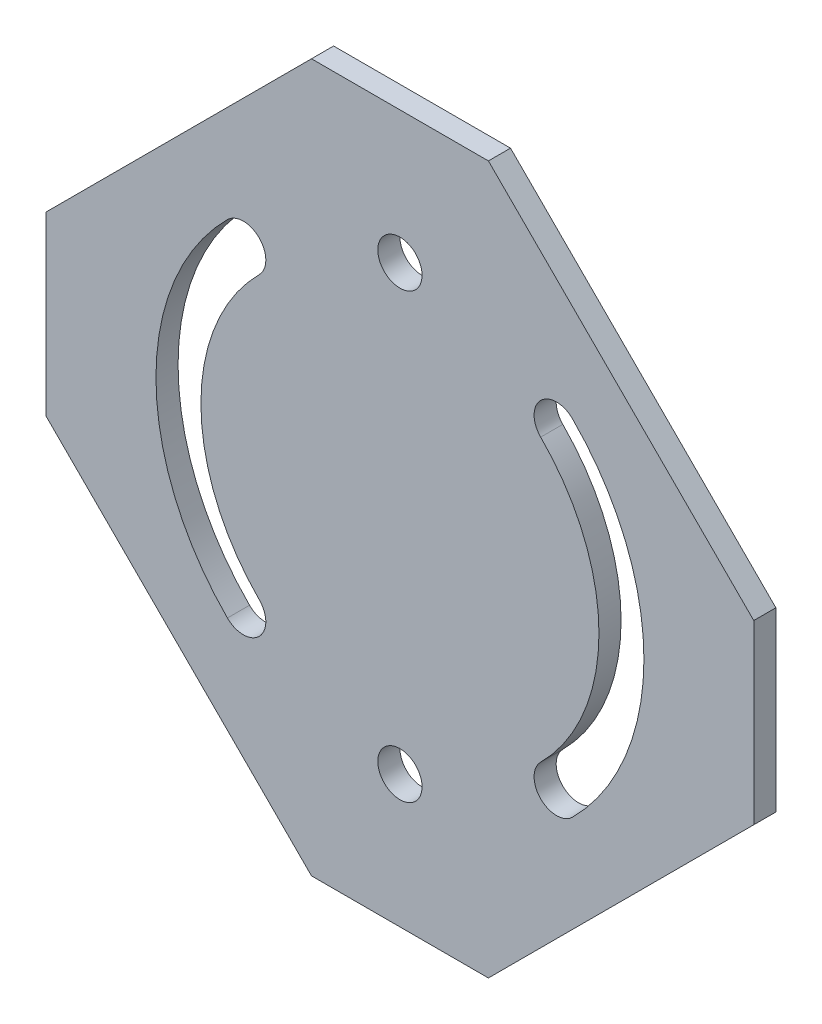
ISO-10303-21;
HEADER;
FILE_DESCRIPTION(('STEP AP214'),'2;1');
FILE_NAME('part.step','',(''),(''),'','','');
FILE_SCHEMA(('AUTOMOTIVE_DESIGN { 1 0 10303 214 1 1 1 1 }'));
ENDSEC;
DATA;
#1=APPLICATION_CONTEXT('core data for automotive mechanical design processes');
#2=APPLICATION_PROTOCOL_DEFINITION('international standard','automotive_design',2000,#1);
#3=PRODUCT_CONTEXT('',#1,'mechanical');
#4=PRODUCT('Part','Part','',(#3));
#5=PRODUCT_RELATED_PRODUCT_CATEGORY('part','',(#4));
#6=PRODUCT_DEFINITION_FORMATION('','',#4);
#7=PRODUCT_DEFINITION_CONTEXT('part definition',#1,'design');
#8=PRODUCT_DEFINITION('design','',#6,#7);
#9=PRODUCT_DEFINITION_SHAPE('','',#8);
#10=(LENGTH_UNIT() NAMED_UNIT(*) SI_UNIT(.MILLI.,.METRE.));
#11=(NAMED_UNIT(*) PLANE_ANGLE_UNIT() SI_UNIT($,.RADIAN.));
#12=(NAMED_UNIT(*) SI_UNIT($,.STERADIAN.) SOLID_ANGLE_UNIT());
#13=UNCERTAINTY_MEASURE_WITH_UNIT(LENGTH_MEASURE(1.E-05),#10,'distance_accuracy_value','');
#14=(GEOMETRIC_REPRESENTATION_CONTEXT(3) GLOBAL_UNCERTAINTY_ASSIGNED_CONTEXT((#13)) GLOBAL_UNIT_ASSIGNED_CONTEXT((#10,
#11,#12)) REPRESENTATION_CONTEXT('',''));
#15=CARTESIAN_POINT('',(0.,0.,0.));
#16=DIRECTION('',(0.,0.,1.));
#17=DIRECTION('',(1.,0.,0.));
#18=AXIS2_PLACEMENT_3D('',#15,#16,#17);
#19=CARTESIAN_POINT('',(0.,0.,3.));
#20=DIRECTION('',(0.,0.,1.));
#21=DIRECTION('',(1.,0.,0.));
#22=AXIS2_PLACEMENT_3D('',#19,#20,#21);
#23=PLANE('',#22);
#24=CARTESIAN_POINT('',(0.,0.,3.));
#25=DIRECTION('',(0.,0.,1.));
#26=DIRECTION('',(1.,0.,0.));
#27=AXIS2_PLACEMENT_3D('',#24,#25,#26);
#28=CIRCLE('',#27,33.1000000000003);
#29=CARTESIAN_POINT('',(-23.4052344572771,23.4052344572728,3.));
#30=VERTEX_POINT('',#29);
#31=CARTESIAN_POINT('',(-23.4052344572791,-23.4052344572712,3.));
#32=VERTEX_POINT('',#31);
#33=EDGE_CURVE('E156',#30,#32,#28,.T.);
#34=ORIENTED_EDGE('',*,*,#33,.F.);
#35=CARTESIAN_POINT('',(-21.248558774656,21.2485587746562,3.));
#36=DIRECTION('',(0.,0.,1.));
#37=DIRECTION('',(1.,0.,0.));
#38=AXIS2_PLACEMENT_3D('',#35,#36,#37);
#39=CIRCLE('',#38,3.05);
#40=CARTESIAN_POINT('',(-19.0918830920388,19.0918830920352,3.));
#41=VERTEX_POINT('',#40);
#42=EDGE_CURVE('E148',#41,#30,#39,.T.);
#43=ORIENTED_EDGE('',*,*,#42,.F.);
#44=CARTESIAN_POINT('',(0.,0.,3.));
#45=DIRECTION('',(0.,0.,-1.));
#46=DIRECTION('',(1.,0.,0.));
#47=AXIS2_PLACEMENT_3D('',#44,#45,#46);
#48=CIRCLE('',#47,27.0000000000003);
#49=CARTESIAN_POINT('',(-19.0918830920403,-19.0918830920338,3.));
#50=VERTEX_POINT('',#49);
#51=EDGE_CURVE('E171',#50,#41,#48,.T.);
#52=ORIENTED_EDGE('',*,*,#51,.F.);
#53=CARTESIAN_POINT('',(-21.2485587746564,-21.248558774656,3.));
#54=DIRECTION('',(0.,0.,1.));
#55=DIRECTION('',(1.,0.,0.));
#56=AXIS2_PLACEMENT_3D('',#53,#54,#55);
#57=CIRCLE('',#56,3.05);
#58=EDGE_CURVE('E169',#32,#50,#57,.T.);
#59=ORIENTED_EDGE('',*,*,#58,.F.);
#60=EDGE_LOOP('',(#34,#43,#52,#59));
#61=FACE_BOUND('',#60,.T.);
#62=CARTESIAN_POINT('',(0.,0.,3.));
#63=DIRECTION('',(0.,0.,1.));
#64=DIRECTION('',(1.,0.,0.));
#65=AXIS2_PLACEMENT_3D('',#62,#63,#64);
#66=CIRCLE('',#65,33.1);
#67=CARTESIAN_POINT('',(23.4052344572766,-23.4052344572728,3.));
#68=VERTEX_POINT('',#67);
#69=CARTESIAN_POINT('',(23.4052344572768,23.405234457273,3.));
#70=VERTEX_POINT('',#69);
#71=EDGE_CURVE('E195',#68,#70,#66,.T.);
#72=ORIENTED_EDGE('',*,*,#71,.F.);
#73=CARTESIAN_POINT('',(21.2485587746555,-21.2485587746563,3.));
#74=DIRECTION('',(0.,0.,1.));
#75=DIRECTION('',(1.,0.,0.));
#76=AXIS2_PLACEMENT_3D('',#73,#74,#75);
#77=CIRCLE('',#76,3.05);
#78=CARTESIAN_POINT('',(19.0918830920383,-19.0918830920352,3.));
#79=VERTEX_POINT('',#78);
#80=EDGE_CURVE('E193',#79,#68,#77,.T.);
#81=ORIENTED_EDGE('',*,*,#80,.F.);
#82=CARTESIAN_POINT('',(0.,0.,3.));
#83=DIRECTION('',(0.,0.,-1.));
#84=DIRECTION('',(1.,0.,0.));
#85=AXIS2_PLACEMENT_3D('',#82,#83,#84);
#86=CIRCLE('',#85,27.);
#87=CARTESIAN_POINT('',(19.0918830920383,19.0918830920352,3.));
#88=VERTEX_POINT('',#87);
#89=EDGE_CURVE('E201',#88,#79,#86,.T.);
#90=ORIENTED_EDGE('',*,*,#89,.F.);
#91=CARTESIAN_POINT('',(21.248558774656,21.2485587746559,3.));
#92=DIRECTION('',(0.,0.,1.));
#93=DIRECTION('',(1.,0.,0.));
#94=AXIS2_PLACEMENT_3D('',#91,#92,#93);
#95=CIRCLE('',#94,3.05);
#96=EDGE_CURVE('E198',#70,#88,#95,.T.);
#97=ORIENTED_EDGE('',*,*,#96,.F.);
#98=EDGE_LOOP('',(#72,#81,#90,#97));
#99=FACE_BOUND('',#98,.T.);
#100=DIRECTION('',(0.707106781186544,-0.707106781186551,0.));
#101=VECTOR('',#100,1.);
#102=CARTESIAN_POINT('',(-12.0000000000005,-48.0000000000003,3.));
#103=LINE('',#102,#101);
#104=CARTESIAN_POINT('',(-48.,-12.0000000000005,3.));
#105=VERTEX_POINT('',#104);
#106=CARTESIAN_POINT('',(-12.0000000000005,-48.0000000000003,3.));
#107=VERTEX_POINT('',#106);
#108=EDGE_CURVE('E224',#105,#107,#103,.T.);
#109=ORIENTED_EDGE('',*,*,#108,.T.);
#110=DIRECTION('',(1.,0.,0.));
#111=VECTOR('',#110,1.);
#112=CARTESIAN_POINT('',(-12.0000000000005,-48.0000000000003,3.));
#113=LINE('',#112,#111);
#114=CARTESIAN_POINT('',(12.,-48.0000000000003,3.));
#115=VERTEX_POINT('',#114);
#116=EDGE_CURVE('E227',#107,#115,#113,.T.);
#117=ORIENTED_EDGE('',*,*,#116,.T.);
#118=DIRECTION('',(0.707106781186549,0.707106781186546,0.));
#119=VECTOR('',#118,1.);
#120=CARTESIAN_POINT('',(12.,-48.0000000000003,3.));
#121=LINE('',#120,#119);
#122=CARTESIAN_POINT('',(48.,-12.0000000000005,3.));
#123=VERTEX_POINT('',#122);
#124=EDGE_CURVE('E230',#115,#123,#121,.T.);
#125=ORIENTED_EDGE('',*,*,#124,.T.);
#126=DIRECTION('',(0.,1.,0.));
#127=VECTOR('',#126,1.);
#128=CARTESIAN_POINT('',(48.,-12.0000000000005,3.));
#129=LINE('',#128,#127);
#130=CARTESIAN_POINT('',(48.0000000000005,12.,3.));
#131=VERTEX_POINT('',#130);
#132=EDGE_CURVE('E232',#123,#131,#129,.T.);
#133=ORIENTED_EDGE('',*,*,#132,.T.);
#134=DIRECTION('',(-0.707106781186547,0.707106781186547,0.));
#135=VECTOR('',#134,1.);
#136=CARTESIAN_POINT('',(48.0000000000005,12.,3.));
#137=LINE('',#136,#135);
#138=CARTESIAN_POINT('',(12.0000000000005,48.,3.));
#139=VERTEX_POINT('',#138);
#140=EDGE_CURVE('E234',#131,#139,#137,.T.);
#141=ORIENTED_EDGE('',*,*,#140,.T.);
#142=DIRECTION('',(-1.,0.,0.));
#143=VECTOR('',#142,1.);
#144=CARTESIAN_POINT('',(12.0000000000005,48.,3.));
#145=LINE('',#144,#143);
#146=CARTESIAN_POINT('',(-12.0000000000005,48.0000000000002,3.));
#147=VERTEX_POINT('',#146);
#148=EDGE_CURVE('E236',#139,#147,#145,.T.);
#149=ORIENTED_EDGE('',*,*,#148,.T.);
#150=DIRECTION('',(-0.707106781186549,-0.707106781186546,0.));
#151=VECTOR('',#150,1.);
#152=CARTESIAN_POINT('',(-12.0000000000005,48.0000000000002,3.));
#153=LINE('',#152,#151);
#154=CARTESIAN_POINT('',(-48.0000000000005,12.0000000000003,3.));
#155=VERTEX_POINT('',#154);
#156=EDGE_CURVE('E238',#147,#155,#153,.T.);
#157=ORIENTED_EDGE('',*,*,#156,.T.);
#158=DIRECTION('',(0.,-1.,0.));
#159=VECTOR('',#158,1.);
#160=CARTESIAN_POINT('',(-48.0000000000005,12.0000000000003,3.));
#161=LINE('',#160,#159);
#162=EDGE_CURVE('E240',#155,#105,#161,.T.);
#163=ORIENTED_EDGE('',*,*,#162,.T.);
#164=EDGE_LOOP('',(#109,#117,#125,#133,#141,#149,#157,#163));
#165=FACE_BOUND('',#164,.T.);
#166=CARTESIAN_POINT('',(0.,30.0500000000002,3.));
#167=DIRECTION('',(0.,0.,1.));
#168=DIRECTION('',(1.,0.,0.));
#169=AXIS2_PLACEMENT_3D('',#166,#167,#168);
#170=CIRCLE('',#169,3.);
#171=CARTESIAN_POINT('',(3.,30.0500000000002,3.));
#172=VERTEX_POINT('',#171);
#173=EDGE_CURVE('E187',#172,#172,#170,.T.);
#174=ORIENTED_EDGE('',*,*,#173,.F.);
#175=EDGE_LOOP('',(#174));
#176=FACE_BOUND('',#175,.T.);
#177=CARTESIAN_POINT('',(-4.54747350886464E-13,-30.0500000000004,3.));
#178=DIRECTION('',(0.,0.,1.));
#179=DIRECTION('',(1.,0.,0.));
#180=AXIS2_PLACEMENT_3D('',#177,#178,#179);
#181=CIRCLE('',#180,3.);
#182=CARTESIAN_POINT('',(2.99999999999955,-30.0500000000004,3.));
#183=VERTEX_POINT('',#182);
#184=EDGE_CURVE('E177',#183,#183,#181,.T.);
#185=ORIENTED_EDGE('',*,*,#184,.F.);
#186=EDGE_LOOP('',(#185));
#187=FACE_BOUND('',#186,.T.);
#188=ADVANCED_FACE('F35',(#61,#99,#165,#176,#187),#23,.T.);
#189=CARTESIAN_POINT('',(0.,0.,0.));
#190=DIRECTION('',(0.,0.,1.));
#191=DIRECTION('',(1.,0.,0.));
#192=AXIS2_PLACEMENT_3D('',#189,#190,#191);
#193=PLANE('',#192);
#194=CARTESIAN_POINT('',(-21.248558774656,21.2485587746562,0.));
#195=DIRECTION('',(0.,0.,1.));
#196=DIRECTION('',(1.,0.,0.));
#197=AXIS2_PLACEMENT_3D('',#194,#195,#196);
#198=CIRCLE('',#197,3.05);
#199=CARTESIAN_POINT('',(-19.0918830920388,19.0918830920352,0.));
#200=VERTEX_POINT('',#199);
#201=CARTESIAN_POINT('',(-23.4052344572771,23.4052344572728,0.));
#202=VERTEX_POINT('',#201);
#203=EDGE_CURVE('E58',#200,#202,#198,.T.);
#204=ORIENTED_EDGE('',*,*,#203,.T.);
#205=CARTESIAN_POINT('',(0.,0.,0.));
#206=DIRECTION('',(0.,0.,1.));
#207=DIRECTION('',(1.,0.,0.));
#208=AXIS2_PLACEMENT_3D('',#205,#206,#207);
#209=CIRCLE('',#208,33.1000000000003);
#210=CARTESIAN_POINT('',(-23.4052344572791,-23.4052344572712,0.));
#211=VERTEX_POINT('',#210);
#212=EDGE_CURVE('E163',#202,#211,#209,.T.);
#213=ORIENTED_EDGE('',*,*,#212,.T.);
#214=CARTESIAN_POINT('',(-21.2485587746564,-21.248558774656,0.));
#215=DIRECTION('',(0.,0.,1.));
#216=DIRECTION('',(1.,0.,0.));
#217=AXIS2_PLACEMENT_3D('',#214,#215,#216);
#218=CIRCLE('',#217,3.05);
#219=CARTESIAN_POINT('',(-19.0918830920403,-19.0918830920338,0.));
#220=VERTEX_POINT('',#219);
#221=EDGE_CURVE('E179',#211,#220,#218,.T.);
#222=ORIENTED_EDGE('',*,*,#221,.T.);
#223=CARTESIAN_POINT('',(0.,0.,0.));
#224=DIRECTION('',(0.,0.,-1.));
#225=DIRECTION('',(1.,0.,0.));
#226=AXIS2_PLACEMENT_3D('',#223,#224,#225);
#227=CIRCLE('',#226,27.0000000000003);
#228=EDGE_CURVE('E157',#220,#200,#227,.T.);
#229=ORIENTED_EDGE('',*,*,#228,.T.);
#230=EDGE_LOOP('',(#204,#213,#222,#229));
#231=FACE_BOUND('',#230,.T.);
#232=CARTESIAN_POINT('',(21.2485587746555,-21.2485587746563,0.));
#233=DIRECTION('',(0.,0.,1.));
#234=DIRECTION('',(1.,0.,0.));
#235=AXIS2_PLACEMENT_3D('',#232,#233,#234);
#236=CIRCLE('',#235,3.05);
#237=CARTESIAN_POINT('',(19.0918830920383,-19.0918830920352,0.));
#238=VERTEX_POINT('',#237);
#239=CARTESIAN_POINT('',(23.4052344572766,-23.4052344572728,0.));
#240=VERTEX_POINT('',#239);
#241=EDGE_CURVE('E190',#238,#240,#236,.T.);
#242=ORIENTED_EDGE('',*,*,#241,.T.);
#243=CARTESIAN_POINT('',(0.,0.,0.));
#244=DIRECTION('',(0.,0.,1.));
#245=DIRECTION('',(1.,0.,0.));
#246=AXIS2_PLACEMENT_3D('',#243,#244,#245);
#247=CIRCLE('',#246,33.1);
#248=CARTESIAN_POINT('',(23.4052344572768,23.405234457273,0.));
#249=VERTEX_POINT('',#248);
#250=EDGE_CURVE('E206',#240,#249,#247,.T.);
#251=ORIENTED_EDGE('',*,*,#250,.T.);
#252=CARTESIAN_POINT('',(21.248558774656,21.2485587746559,0.));
#253=DIRECTION('',(0.,0.,1.));
#254=DIRECTION('',(1.,0.,0.));
#255=AXIS2_PLACEMENT_3D('',#252,#253,#254);
#256=CIRCLE('',#255,3.05);
#257=CARTESIAN_POINT('',(19.0918830920383,19.0918830920352,0.));
#258=VERTEX_POINT('',#257);
#259=EDGE_CURVE('E209',#249,#258,#256,.T.);
#260=ORIENTED_EDGE('',*,*,#259,.T.);
#261=CARTESIAN_POINT('',(0.,0.,0.));
#262=DIRECTION('',(0.,0.,-1.));
#263=DIRECTION('',(1.,0.,0.));
#264=AXIS2_PLACEMENT_3D('',#261,#262,#263);
#265=CIRCLE('',#264,27.);
#266=EDGE_CURVE('E196',#258,#238,#265,.T.);
#267=ORIENTED_EDGE('',*,*,#266,.T.);
#268=EDGE_LOOP('',(#242,#251,#260,#267));
#269=FACE_BOUND('',#268,.T.);
#270=DIRECTION('',(0.707106781186544,-0.707106781186551,0.));
#271=VECTOR('',#270,1.);
#272=CARTESIAN_POINT('',(-12.0000000000005,-48.0000000000003,0.));
#273=LINE('',#272,#271);
#274=CARTESIAN_POINT('',(-48.,-12.0000000000005,0.));
#275=VERTEX_POINT('',#274);
#276=CARTESIAN_POINT('',(-12.0000000000005,-48.0000000000003,0.));
#277=VERTEX_POINT('',#276);
#278=EDGE_CURVE('E223',#275,#277,#273,.T.);
#279=ORIENTED_EDGE('',*,*,#278,.F.);
#280=DIRECTION('',(0.,-1.,0.));
#281=VECTOR('',#280,1.);
#282=CARTESIAN_POINT('',(-48.0000000000005,12.0000000000003,0.));
#283=LINE('',#282,#281);
#284=CARTESIAN_POINT('',(-48.0000000000005,12.0000000000003,0.));
#285=VERTEX_POINT('',#284);
#286=EDGE_CURVE('E228',#285,#275,#283,.T.);
#287=ORIENTED_EDGE('',*,*,#286,.F.);
#288=DIRECTION('',(-0.707106781186549,-0.707106781186546,0.));
#289=VECTOR('',#288,1.);
#290=CARTESIAN_POINT('',(-12.0000000000005,48.0000000000002,0.));
#291=LINE('',#290,#289);
#292=CARTESIAN_POINT('',(-12.0000000000005,48.0000000000002,0.));
#293=VERTEX_POINT('',#292);
#294=EDGE_CURVE('E255',#293,#285,#291,.T.);
#295=ORIENTED_EDGE('',*,*,#294,.F.);
#296=DIRECTION('',(-1.,0.,0.));
#297=VECTOR('',#296,1.);
#298=CARTESIAN_POINT('',(12.0000000000005,48.,0.));
#299=LINE('',#298,#297);
#300=CARTESIAN_POINT('',(12.0000000000005,48.,0.));
#301=VERTEX_POINT('',#300);
#302=EDGE_CURVE('E253',#301,#293,#299,.T.);
#303=ORIENTED_EDGE('',*,*,#302,.F.);
#304=DIRECTION('',(-0.707106781186547,0.707106781186547,0.));
#305=VECTOR('',#304,1.);
#306=CARTESIAN_POINT('',(48.0000000000005,12.,0.));
#307=LINE('',#306,#305);
#308=CARTESIAN_POINT('',(48.0000000000005,12.,0.));
#309=VERTEX_POINT('',#308);
#310=EDGE_CURVE('E251',#309,#301,#307,.T.);
#311=ORIENTED_EDGE('',*,*,#310,.F.);
#312=DIRECTION('',(0.,1.,0.));
#313=VECTOR('',#312,1.);
#314=CARTESIAN_POINT('',(48.,-12.0000000000005,0.));
#315=LINE('',#314,#313);
#316=CARTESIAN_POINT('',(48.,-12.0000000000005,0.));
#317=VERTEX_POINT('',#316);
#318=EDGE_CURVE('E249',#317,#309,#315,.T.);
#319=ORIENTED_EDGE('',*,*,#318,.F.);
#320=DIRECTION('',(0.707106781186549,0.707106781186546,0.));
#321=VECTOR('',#320,1.);
#322=CARTESIAN_POINT('',(12.,-48.0000000000003,0.));
#323=LINE('',#322,#321);
#324=CARTESIAN_POINT('',(12.,-48.0000000000003,0.));
#325=VERTEX_POINT('',#324);
#326=EDGE_CURVE('E247',#325,#317,#323,.T.);
#327=ORIENTED_EDGE('',*,*,#326,.F.);
#328=DIRECTION('',(1.,0.,0.));
#329=VECTOR('',#328,1.);
#330=CARTESIAN_POINT('',(-12.0000000000005,-48.0000000000003,0.));
#331=LINE('',#330,#329);
#332=EDGE_CURVE('E245',#277,#325,#331,.T.);
#333=ORIENTED_EDGE('',*,*,#332,.F.);
#334=EDGE_LOOP('',(#279,#287,#295,#303,#311,#319,#327,#333));
#335=FACE_BOUND('',#334,.T.);
#336=CARTESIAN_POINT('',(0.,30.0500000000002,0.));
#337=DIRECTION('',(0.,0.,1.));
#338=DIRECTION('',(1.,0.,0.));
#339=AXIS2_PLACEMENT_3D('',#336,#337,#338);
#340=CIRCLE('',#339,3.);
#341=CARTESIAN_POINT('',(3.,30.0500000000002,0.));
#342=VERTEX_POINT('',#341);
#343=EDGE_CURVE('E164',#342,#342,#340,.T.);
#344=ORIENTED_EDGE('',*,*,#343,.T.);
#345=EDGE_LOOP('',(#344));
#346=FACE_BOUND('',#345,.T.);
#347=CARTESIAN_POINT('',(-4.54747350886464E-13,-30.0500000000004,0.));
#348=DIRECTION('',(0.,0.,1.));
#349=DIRECTION('',(1.,0.,0.));
#350=AXIS2_PLACEMENT_3D('',#347,#348,#349);
#351=CIRCLE('',#350,3.);
#352=CARTESIAN_POINT('',(2.99999999999955,-30.0500000000004,0.));
#353=VERTEX_POINT('',#352);
#354=EDGE_CURVE('E392',#353,#353,#351,.T.);
#355=ORIENTED_EDGE('',*,*,#354,.T.);
#356=EDGE_LOOP('',(#355));
#357=FACE_BOUND('',#356,.T.);
#358=ADVANCED_FACE('F285',(#231,#269,#335,#346,#357),#193,.F.);
#359=CARTESIAN_POINT('',(-12.0000000000005,-48.0000000000003,3.));
#360=DIRECTION('',(0.707106781186551,0.707106781186544,0.));
#361=DIRECTION('',(-0.707106781186544,0.707106781186551,0.));
#362=AXIS2_PLACEMENT_3D('',#359,#360,#361);
#363=PLANE('',#362);
#364=ORIENTED_EDGE('',*,*,#278,.T.);
#365=DIRECTION('',(0.,0.,-1.));
#366=VECTOR('',#365,1.);
#367=CARTESIAN_POINT('',(-12.0000000000005,-48.0000000000003,3.));
#368=LINE('',#367,#366);
#369=EDGE_CURVE('E11',#107,#277,#368,.T.);
#370=ORIENTED_EDGE('',*,*,#369,.F.);
#371=ORIENTED_EDGE('',*,*,#108,.F.);
#372=DIRECTION('',(0.,0.,-1.));
#373=VECTOR('',#372,1.);
#374=CARTESIAN_POINT('',(-48.,-12.0000000000005,3.));
#375=LINE('',#374,#373);
#376=EDGE_CURVE('E242',#105,#275,#375,.T.);
#377=ORIENTED_EDGE('',*,*,#376,.T.);
#378=EDGE_LOOP('',(#364,#370,#371,#377));
#379=FACE_BOUND('',#378,.T.);
#380=ADVANCED_FACE('F37',(#379),#363,.F.);
#381=CARTESIAN_POINT('',(-12.0000000000005,-48.0000000000003,3.));
#382=DIRECTION('',(0.,1.,0.));
#383=DIRECTION('',(0.,0.,1.));
#384=AXIS2_PLACEMENT_3D('',#381,#382,#383);
#385=PLANE('',#384);
#386=ORIENTED_EDGE('',*,*,#332,.T.);
#387=DIRECTION('',(0.,0.,-1.));
#388=VECTOR('',#387,1.);
#389=CARTESIAN_POINT('',(12.,-48.0000000000003,3.));
#390=LINE('',#389,#388);
#391=EDGE_CURVE('E43',#115,#325,#390,.T.);
#392=ORIENTED_EDGE('',*,*,#391,.F.);
#393=ORIENTED_EDGE('',*,*,#116,.F.);
#394=ORIENTED_EDGE('',*,*,#369,.T.);
#395=EDGE_LOOP('',(#386,#392,#393,#394));
#396=FACE_BOUND('',#395,.T.);
#397=ADVANCED_FACE('F303',(#396),#385,.F.);
#398=CARTESIAN_POINT('',(12.,-48.0000000000003,3.));
#399=DIRECTION('',(-0.707106781186546,0.707106781186549,0.));
#400=DIRECTION('',(-0.707106781186549,-0.707106781186546,0.));
#401=AXIS2_PLACEMENT_3D('',#398,#399,#400);
#402=PLANE('',#401);
#403=ORIENTED_EDGE('',*,*,#326,.T.);
#404=DIRECTION('',(0.,0.,-1.));
#405=VECTOR('',#404,1.);
#406=CARTESIAN_POINT('',(48.,-12.0000000000005,3.));
#407=LINE('',#406,#405);
#408=EDGE_CURVE('E272',#123,#317,#407,.T.);
#409=ORIENTED_EDGE('',*,*,#408,.F.);
#410=ORIENTED_EDGE('',*,*,#124,.F.);
#411=ORIENTED_EDGE('',*,*,#391,.T.);
#412=EDGE_LOOP('',(#403,#409,#410,#411));
#413=FACE_BOUND('',#412,.T.);
#414=ADVANCED_FACE('F279',(#413),#402,.F.);
#415=CARTESIAN_POINT('',(48.,-12.0000000000005,3.));
#416=DIRECTION('',(-1.,0.,0.));
#417=DIRECTION('',(0.,-1.,0.));
#418=AXIS2_PLACEMENT_3D('',#415,#416,#417);
#419=PLANE('',#418);
#420=ORIENTED_EDGE('',*,*,#318,.T.);
#421=DIRECTION('',(0.,0.,-1.));
#422=VECTOR('',#421,1.);
#423=CARTESIAN_POINT('',(48.0000000000005,12.,3.));
#424=LINE('',#423,#422);
#425=EDGE_CURVE('E269',#131,#309,#424,.T.);
#426=ORIENTED_EDGE('',*,*,#425,.F.);
#427=ORIENTED_EDGE('',*,*,#132,.F.);
#428=ORIENTED_EDGE('',*,*,#408,.T.);
#429=EDGE_LOOP('',(#420,#426,#427,#428));
#430=FACE_BOUND('',#429,.T.);
#431=ADVANCED_FACE('F291',(#430),#419,.F.);
#432=CARTESIAN_POINT('',(48.0000000000005,12.,3.));
#433=DIRECTION('',(-0.707106781186548,-0.707106781186548,0.));
#434=DIRECTION('',(0.707106781186548,-0.707106781186548,0.));
#435=AXIS2_PLACEMENT_3D('',#432,#433,#434);
#436=PLANE('',#435);
#437=ORIENTED_EDGE('',*,*,#310,.T.);
#438=DIRECTION('',(0.,0.,-1.));
#439=VECTOR('',#438,1.);
#440=CARTESIAN_POINT('',(12.0000000000005,48.,3.));
#441=LINE('',#440,#439);
#442=EDGE_CURVE('E266',#139,#301,#441,.T.);
#443=ORIENTED_EDGE('',*,*,#442,.F.);
#444=ORIENTED_EDGE('',*,*,#140,.F.);
#445=ORIENTED_EDGE('',*,*,#425,.T.);
#446=EDGE_LOOP('',(#437,#443,#444,#445));
#447=FACE_BOUND('',#446,.T.);
#448=ADVANCED_FACE('F295',(#447),#436,.F.);
#449=CARTESIAN_POINT('',(12.0000000000005,48.,3.));
#450=DIRECTION('',(0.,-1.,0.));
#451=DIRECTION('',(1.,0.,0.));
#452=AXIS2_PLACEMENT_3D('',#449,#450,#451);
#453=PLANE('',#452);
#454=ORIENTED_EDGE('',*,*,#302,.T.);
#455=DIRECTION('',(0.,0.,-1.));
#456=VECTOR('',#455,1.);
#457=CARTESIAN_POINT('',(-12.0000000000005,48.0000000000002,3.));
#458=LINE('',#457,#456);
#459=EDGE_CURVE('E263',#147,#293,#458,.T.);
#460=ORIENTED_EDGE('',*,*,#459,.F.);
#461=ORIENTED_EDGE('',*,*,#148,.F.);
#462=ORIENTED_EDGE('',*,*,#442,.T.);
#463=EDGE_LOOP('',(#454,#460,#461,#462));
#464=FACE_BOUND('',#463,.T.);
#465=ADVANCED_FACE('F316',(#464),#453,.F.);
#466=CARTESIAN_POINT('',(-12.0000000000005,48.0000000000002,3.));
#467=DIRECTION('',(0.707106781186546,-0.707106781186549,0.));
#468=DIRECTION('',(0.707106781186549,0.707106781186546,0.));
#469=AXIS2_PLACEMENT_3D('',#466,#467,#468);
#470=PLANE('',#469);
#471=ORIENTED_EDGE('',*,*,#294,.T.);
#472=DIRECTION('',(0.,0.,-1.));
#473=VECTOR('',#472,1.);
#474=CARTESIAN_POINT('',(-48.0000000000005,12.0000000000003,3.));
#475=LINE('',#474,#473);
#476=EDGE_CURVE('E260',#155,#285,#475,.T.);
#477=ORIENTED_EDGE('',*,*,#476,.F.);
#478=ORIENTED_EDGE('',*,*,#156,.F.);
#479=ORIENTED_EDGE('',*,*,#459,.T.);
#480=EDGE_LOOP('',(#471,#477,#478,#479));
#481=FACE_BOUND('',#480,.T.);
#482=ADVANCED_FACE('F314',(#481),#470,.F.);
#483=CARTESIAN_POINT('',(-48.0000000000005,12.0000000000003,3.));
#484=DIRECTION('',(1.,0.,0.));
#485=DIRECTION('',(0.,1.,0.));
#486=AXIS2_PLACEMENT_3D('',#483,#484,#485);
#487=PLANE('',#486);
#488=ORIENTED_EDGE('',*,*,#286,.T.);
#489=ORIENTED_EDGE('',*,*,#376,.F.);
#490=ORIENTED_EDGE('',*,*,#162,.F.);
#491=ORIENTED_EDGE('',*,*,#476,.T.);
#492=EDGE_LOOP('',(#488,#489,#490,#491));
#493=FACE_BOUND('',#492,.T.);
#494=ADVANCED_FACE('F309',(#493),#487,.F.);
#495=CARTESIAN_POINT('',(21.2485587746555,-21.2485587746563,3.));
#496=DIRECTION('',(0.,0.,-1.));
#497=DIRECTION('',(-1.,0.,0.));
#498=AXIS2_PLACEMENT_3D('',#495,#496,#497);
#499=CYLINDRICAL_SURFACE('',#498,3.05);
#500=ORIENTED_EDGE('',*,*,#241,.F.);
#501=DIRECTION('',(0.,0.,-1.));
#502=VECTOR('',#501,1.);
#503=CARTESIAN_POINT('',(19.0918830920383,-19.0918830920352,3.));
#504=LINE('',#503,#502);
#505=EDGE_CURVE('E203',#79,#238,#504,.T.);
#506=ORIENTED_EDGE('',*,*,#505,.F.);
#507=ORIENTED_EDGE('',*,*,#80,.T.);
#508=DIRECTION('',(0.,0.,-1.));
#509=VECTOR('',#508,1.);
#510=CARTESIAN_POINT('',(23.4052344572766,-23.4052344572728,3.));
#511=LINE('',#510,#509);
#512=EDGE_CURVE('E220',#68,#240,#511,.T.);
#513=ORIENTED_EDGE('',*,*,#512,.T.);
#514=EDGE_LOOP('',(#500,#506,#507,#513));
#515=FACE_BOUND('',#514,.T.);
#516=ADVANCED_FACE('F333',(#515),#499,.F.);
#517=CARTESIAN_POINT('',(0.,0.,3.));
#518=DIRECTION('',(0.,0.,-1.));
#519=DIRECTION('',(-1.,0.,0.));
#520=AXIS2_PLACEMENT_3D('',#517,#518,#519);
#521=CYLINDRICAL_SURFACE('',#520,33.1);
#522=ORIENTED_EDGE('',*,*,#250,.F.);
#523=ORIENTED_EDGE('',*,*,#512,.F.);
#524=ORIENTED_EDGE('',*,*,#71,.T.);
#525=DIRECTION('',(0.,0.,-1.));
#526=VECTOR('',#525,1.);
#527=CARTESIAN_POINT('',(23.4052344572768,23.405234457273,3.));
#528=LINE('',#527,#526);
#529=EDGE_CURVE('E218',#70,#249,#528,.T.);
#530=ORIENTED_EDGE('',*,*,#529,.T.);
#531=EDGE_LOOP('',(#522,#523,#524,#530));
#532=FACE_BOUND('',#531,.T.);
#533=ADVANCED_FACE('F340',(#532),#521,.F.);
#534=CARTESIAN_POINT('',(21.248558774656,21.2485587746559,3.));
#535=DIRECTION('',(0.,0.,-1.));
#536=DIRECTION('',(-1.,0.,0.));
#537=AXIS2_PLACEMENT_3D('',#534,#535,#536);
#538=CYLINDRICAL_SURFACE('',#537,3.05);
#539=ORIENTED_EDGE('',*,*,#259,.F.);
#540=ORIENTED_EDGE('',*,*,#529,.F.);
#541=ORIENTED_EDGE('',*,*,#96,.T.);
#542=DIRECTION('',(0.,0.,-1.));
#543=VECTOR('',#542,1.);
#544=CARTESIAN_POINT('',(19.0918830920383,19.0918830920352,3.));
#545=LINE('',#544,#543);
#546=EDGE_CURVE('E216',#88,#258,#545,.T.);
#547=ORIENTED_EDGE('',*,*,#546,.T.);
#548=EDGE_LOOP('',(#539,#540,#541,#547));
#549=FACE_BOUND('',#548,.T.);
#550=ADVANCED_FACE('F345',(#549),#538,.F.);
#551=CARTESIAN_POINT('',(0.,0.,3.));
#552=DIRECTION('',(0.,0.,-1.));
#553=DIRECTION('',(-1.,0.,0.));
#554=AXIS2_PLACEMENT_3D('',#551,#552,#553);
#555=CYLINDRICAL_SURFACE('',#554,27.);
#556=ORIENTED_EDGE('',*,*,#266,.F.);
#557=ORIENTED_EDGE('',*,*,#546,.F.);
#558=ORIENTED_EDGE('',*,*,#89,.T.);
#559=ORIENTED_EDGE('',*,*,#505,.T.);
#560=EDGE_LOOP('',(#556,#557,#558,#559));
#561=FACE_BOUND('',#560,.T.);
#562=ADVANCED_FACE('F353',(#561),#555,.T.);
#563=CARTESIAN_POINT('',(0.,30.0500000000002,3.));
#564=DIRECTION('',(0.,0.,-1.));
#565=DIRECTION('',(-1.,0.,0.));
#566=AXIS2_PLACEMENT_3D('',#563,#564,#565);
#567=CYLINDRICAL_SURFACE('',#566,3.);
#568=ORIENTED_EDGE('',*,*,#173,.T.);
#569=EDGE_LOOP('',(#568));
#570=FACE_BOUND('',#569,.T.);
#571=ORIENTED_EDGE('',*,*,#343,.F.);
#572=EDGE_LOOP('',(#571));
#573=FACE_BOUND('',#572,.T.);
#574=ADVANCED_FACE('F365',(#570,#573),#567,.F.);
#575=CARTESIAN_POINT('',(-21.248558774656,21.2485587746562,3.));
#576=DIRECTION('',(0.,0.,-1.));
#577=DIRECTION('',(-1.,0.,0.));
#578=AXIS2_PLACEMENT_3D('',#575,#576,#577);
#579=CYLINDRICAL_SURFACE('',#578,3.05);
#580=ORIENTED_EDGE('',*,*,#203,.F.);
#581=DIRECTION('',(0.,0.,-1.));
#582=VECTOR('',#581,1.);
#583=CARTESIAN_POINT('',(-19.0918830920388,19.0918830920352,3.));
#584=LINE('',#583,#582);
#585=EDGE_CURVE('E152',#41,#200,#584,.T.);
#586=ORIENTED_EDGE('',*,*,#585,.F.);
#587=ORIENTED_EDGE('',*,*,#42,.T.);
#588=DIRECTION('',(0.,0.,-1.));
#589=VECTOR('',#588,1.);
#590=CARTESIAN_POINT('',(-23.4052344572771,23.4052344572728,3.));
#591=LINE('',#590,#589);
#592=EDGE_CURVE('E151',#30,#202,#591,.T.);
#593=ORIENTED_EDGE('',*,*,#592,.T.);
#594=EDGE_LOOP('',(#580,#586,#587,#593));
#595=FACE_BOUND('',#594,.T.);
#596=ADVANCED_FACE('F150',(#595),#579,.F.);
#597=CARTESIAN_POINT('',(0.,0.,3.));
#598=DIRECTION('',(0.,0.,-1.));
#599=DIRECTION('',(-1.,0.,0.));
#600=AXIS2_PLACEMENT_3D('',#597,#598,#599);
#601=CYLINDRICAL_SURFACE('',#600,33.1000000000003);
#602=ORIENTED_EDGE('',*,*,#212,.F.);
#603=ORIENTED_EDGE('',*,*,#592,.F.);
#604=ORIENTED_EDGE('',*,*,#33,.T.);
#605=DIRECTION('',(0.,0.,-1.));
#606=VECTOR('',#605,1.);
#607=CARTESIAN_POINT('',(-23.4052344572791,-23.4052344572712,3.));
#608=LINE('',#607,#606);
#609=EDGE_CURVE('E165',#32,#211,#608,.T.);
#610=ORIENTED_EDGE('',*,*,#609,.T.);
#611=EDGE_LOOP('',(#602,#603,#604,#610));
#612=FACE_BOUND('',#611,.T.);
#613=ADVANCED_FACE('F160',(#612),#601,.F.);
#614=CARTESIAN_POINT('',(-21.2485587746564,-21.248558774656,3.));
#615=DIRECTION('',(0.,0.,-1.));
#616=DIRECTION('',(-1.,0.,0.));
#617=AXIS2_PLACEMENT_3D('',#614,#615,#616);
#618=CYLINDRICAL_SURFACE('',#617,3.05);
#619=ORIENTED_EDGE('',*,*,#221,.F.);
#620=ORIENTED_EDGE('',*,*,#609,.F.);
#621=ORIENTED_EDGE('',*,*,#58,.T.);
#622=DIRECTION('',(0.,0.,-1.));
#623=VECTOR('',#622,1.);
#624=CARTESIAN_POINT('',(-19.0918830920403,-19.0918830920338,3.));
#625=LINE('',#624,#623);
#626=EDGE_CURVE('E50',#50,#220,#625,.T.);
#627=ORIENTED_EDGE('',*,*,#626,.T.);
#628=EDGE_LOOP('',(#619,#620,#621,#627));
#629=FACE_BOUND('',#628,.T.);
#630=ADVANCED_FACE('F375',(#629),#618,.F.);
#631=CARTESIAN_POINT('',(0.,0.,3.));
#632=DIRECTION('',(0.,0.,-1.));
#633=DIRECTION('',(-1.,0.,0.));
#634=AXIS2_PLACEMENT_3D('',#631,#632,#633);
#635=CYLINDRICAL_SURFACE('',#634,27.0000000000003);
#636=ORIENTED_EDGE('',*,*,#228,.F.);
#637=ORIENTED_EDGE('',*,*,#626,.F.);
#638=ORIENTED_EDGE('',*,*,#51,.T.);
#639=ORIENTED_EDGE('',*,*,#585,.T.);
#640=EDGE_LOOP('',(#636,#637,#638,#639));
#641=FACE_BOUND('',#640,.T.);
#642=ADVANCED_FACE('F378',(#641),#635,.T.);
#643=CARTESIAN_POINT('',(-4.54747350886464E-13,-30.0500000000004,3.));
#644=DIRECTION('',(0.,0.,-1.));
#645=DIRECTION('',(-1.,0.,0.));
#646=AXIS2_PLACEMENT_3D('',#643,#644,#645);
#647=CYLINDRICAL_SURFACE('',#646,3.);
#648=ORIENTED_EDGE('',*,*,#184,.T.);
#649=EDGE_LOOP('',(#648));
#650=FACE_BOUND('',#649,.T.);
#651=ORIENTED_EDGE('',*,*,#354,.F.);
#652=EDGE_LOOP('',(#651));
#653=FACE_BOUND('',#652,.T.);
#654=ADVANCED_FACE('F382',(#650,#653),#647,.F.);
#655=CLOSED_SHELL('',(#188,#358,#380,#397,#414,#431,#448,#465,#482,#494,#516,#533,#550,#562,
#574,#596,#613,#630,#642,#654));
#656=MANIFOLD_SOLID_BREP('B2',#655);
#657=ADVANCED_BREP_SHAPE_REPRESENTATION('',(#18,#656),#14);
#658=SHAPE_DEFINITION_REPRESENTATION(#9,#657);
ENDSEC;
END-ISO-10303-21;
